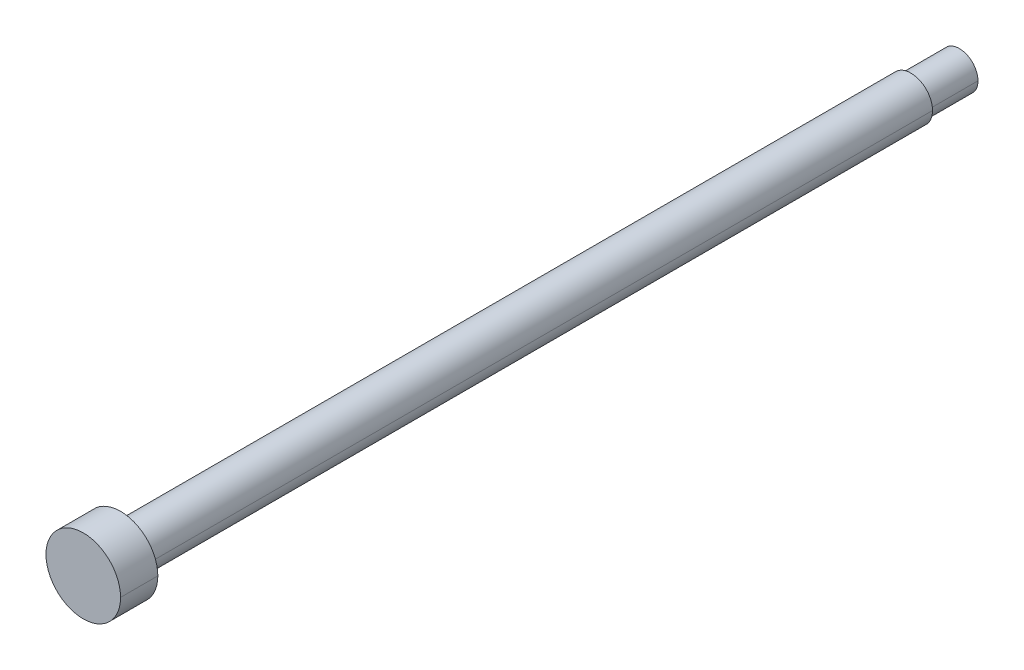
ISO-10303-21;
HEADER;
FILE_DESCRIPTION(('STEP AP214'),'2;1');
FILE_NAME('part.step','',(''),(''),'','','');
FILE_SCHEMA(('AUTOMOTIVE_DESIGN { 1 0 10303 214 1 1 1 1 }'));
ENDSEC;
DATA;
#1=APPLICATION_CONTEXT('core data for automotive mechanical design processes');
#2=APPLICATION_PROTOCOL_DEFINITION('international standard','automotive_design',2000,#1);
#3=PRODUCT_CONTEXT('',#1,'mechanical');
#4=PRODUCT('Part','Part','',(#3));
#5=PRODUCT_RELATED_PRODUCT_CATEGORY('part','',(#4));
#6=PRODUCT_DEFINITION_FORMATION('','',#4);
#7=PRODUCT_DEFINITION_CONTEXT('part definition',#1,'design');
#8=PRODUCT_DEFINITION('design','',#6,#7);
#9=PRODUCT_DEFINITION_SHAPE('','',#8);
#10=(LENGTH_UNIT() NAMED_UNIT(*) SI_UNIT(.MILLI.,.METRE.));
#11=(NAMED_UNIT(*) PLANE_ANGLE_UNIT() SI_UNIT($,.RADIAN.));
#12=(NAMED_UNIT(*) SI_UNIT($,.STERADIAN.) SOLID_ANGLE_UNIT());
#13=UNCERTAINTY_MEASURE_WITH_UNIT(LENGTH_MEASURE(1.E-05),#10,'distance_accuracy_value','');
#14=(GEOMETRIC_REPRESENTATION_CONTEXT(3) GLOBAL_UNCERTAINTY_ASSIGNED_CONTEXT((#13)) GLOBAL_UNIT_ASSIGNED_CONTEXT((#10,
#11,#12)) REPRESENTATION_CONTEXT('',''));
#15=CARTESIAN_POINT('',(0.,0.,0.));
#16=DIRECTION('',(0.,0.,1.));
#17=DIRECTION('',(1.,0.,0.));
#18=AXIS2_PLACEMENT_3D('',#15,#16,#17);
#19=CARTESIAN_POINT('',(0.,0.,-22.5));
#20=DIRECTION('',(0.,0.,-1.));
#21=DIRECTION('',(0.,-1.,0.));
#22=AXIS2_PLACEMENT_3D('',#19,#20,#21);
#23=PLANE('',#22);
#24=CARTESIAN_POINT('',(3.25,-1.5,-22.5));
#25=DIRECTION('',(0.,0.,-1.));
#26=DIRECTION('',(-1.,0.,0.));
#27=AXIS2_PLACEMENT_3D('',#24,#25,#26);
#28=CIRCLE('',#27,0.499999999999941);
#29=CARTESIAN_POINT('',(3.74999999999993,-1.5,-22.5));
#30=VERTEX_POINT('',#29);
#31=CARTESIAN_POINT('',(2.75000000000006,-1.5,-22.5));
#32=VERTEX_POINT('',#31);
#33=EDGE_CURVE('E10',#30,#32,#28,.T.);
#34=ORIENTED_EDGE('',*,*,#33,.T.);
#35=CARTESIAN_POINT('',(3.25,-1.5,-22.5));
#36=DIRECTION('',(0.,0.,-1.));
#37=DIRECTION('',(-1.,0.,0.));
#38=AXIS2_PLACEMENT_3D('',#35,#36,#37);
#39=CIRCLE('',#38,0.499999999999941);
#40=EDGE_CURVE('E146',#32,#30,#39,.T.);
#41=ORIENTED_EDGE('',*,*,#40,.T.);
#42=EDGE_LOOP('',(#34,#41));
#43=FACE_BOUND('',#42,.T.);
#44=ADVANCED_FACE('F15',(#43),#23,.T.);
#45=CARTESIAN_POINT('',(3.25,-1.5,-22.5));
#46=DIRECTION('',(0.,0.,1.));
#47=DIRECTION('',(1.,0.,0.));
#48=AXIS2_PLACEMENT_3D('',#45,#46,#47);
#49=CYLINDRICAL_SURFACE('',#48,0.499999999999941);
#50=DIRECTION('',(0.,0.,1.));
#51=VECTOR('',#50,1.);
#52=CARTESIAN_POINT('',(2.75000000000006,-1.5,-22.5));
#53=LINE('',#52,#51);
#54=CARTESIAN_POINT('',(2.75000000000006,-1.5,-21.2));
#55=VERTEX_POINT('',#54);
#56=EDGE_CURVE('E147',#32,#55,#53,.T.);
#57=ORIENTED_EDGE('',*,*,#56,.F.);
#58=ORIENTED_EDGE('',*,*,#33,.F.);
#59=DIRECTION('',(0.,0.,1.));
#60=VECTOR('',#59,1.);
#61=CARTESIAN_POINT('',(3.74999999999993,-1.5,-22.5));
#62=LINE('',#61,#60);
#63=CARTESIAN_POINT('',(3.74999999999993,-1.5,-21.2));
#64=VERTEX_POINT('',#63);
#65=EDGE_CURVE('E155',#30,#64,#62,.T.);
#66=ORIENTED_EDGE('',*,*,#65,.T.);
#67=CARTESIAN_POINT('',(3.25,-1.5,-21.2));
#68=DIRECTION('',(0.,0.,-1.));
#69=DIRECTION('',(-1.,0.,0.));
#70=AXIS2_PLACEMENT_3D('',#67,#68,#69);
#71=CIRCLE('',#70,0.499999999999941);
#72=EDGE_CURVE('E114',#64,#55,#71,.T.);
#73=ORIENTED_EDGE('',*,*,#72,.T.);
#74=EDGE_LOOP('',(#57,#58,#66,#73));
#75=FACE_BOUND('',#74,.T.);
#76=ADVANCED_FACE('F172',(#75),#49,.T.);
#77=CARTESIAN_POINT('',(0.,0.,1.));
#78=DIRECTION('',(0.,0.,1.));
#79=DIRECTION('',(1.,0.,0.));
#80=AXIS2_PLACEMENT_3D('',#77,#78,#79);
#81=PLANE('',#80);
#82=CARTESIAN_POINT('',(3.25000000000004,-1.50000000000005,1.));
#83=DIRECTION('',(0.,0.,1.));
#84=DIRECTION('',(1.,0.,0.));
#85=AXIS2_PLACEMENT_3D('',#82,#83,#84);
#86=CIRCLE('',#85,1.);
#87=CARTESIAN_POINT('',(4.25000000000005,-1.50000000000005,1.));
#88=VERTEX_POINT('',#87);
#89=CARTESIAN_POINT('',(2.25000000000004,-1.50000000000005,1.));
#90=VERTEX_POINT('',#89);
#91=EDGE_CURVE('E88',#88,#90,#86,.T.);
#92=ORIENTED_EDGE('',*,*,#91,.T.);
#93=CARTESIAN_POINT('',(3.25000000000004,-1.50000000000005,1.));
#94=DIRECTION('',(0.,0.,1.));
#95=DIRECTION('',(1.,0.,0.));
#96=AXIS2_PLACEMENT_3D('',#93,#94,#95);
#97=CIRCLE('',#96,1.);
#98=EDGE_CURVE('E25',#90,#88,#97,.T.);
#99=ORIENTED_EDGE('',*,*,#98,.T.);
#100=EDGE_LOOP('',(#92,#99));
#101=FACE_BOUND('',#100,.T.);
#102=ADVANCED_FACE('F17',(#101),#81,.T.);
#103=CARTESIAN_POINT('',(0.,0.,0.));
#104=DIRECTION('',(0.,0.,1.));
#105=DIRECTION('',(0.,-1.,0.));
#106=AXIS2_PLACEMENT_3D('',#103,#104,#105);
#107=PLANE('',#106);
#108=CARTESIAN_POINT('',(3.25,-1.5,0.));
#109=DIRECTION('',(0.,0.,1.));
#110=DIRECTION('',(0.,-1.,0.));
#111=AXIS2_PLACEMENT_3D('',#108,#109,#110);
#112=CIRCLE('',#111,0.58);
#113=CARTESIAN_POINT('',(2.67,-1.5,0.));
#114=VERTEX_POINT('',#113);
#115=CARTESIAN_POINT('',(3.83,-1.5,0.));
#116=VERTEX_POINT('',#115);
#117=EDGE_CURVE('E115',#114,#116,#112,.T.);
#118=ORIENTED_EDGE('',*,*,#117,.T.);
#119=CARTESIAN_POINT('',(3.25,-1.5,0.));
#120=DIRECTION('',(0.,0.,1.));
#121=DIRECTION('',(0.,-1.,0.));
#122=AXIS2_PLACEMENT_3D('',#119,#120,#121);
#123=CIRCLE('',#122,0.58);
#124=EDGE_CURVE('E99',#116,#114,#123,.T.);
#125=ORIENTED_EDGE('',*,*,#124,.T.);
#126=EDGE_LOOP('',(#118,#125));
#127=FACE_BOUND('',#126,.T.);
#128=CARTESIAN_POINT('',(3.25000000000004,-1.50000000000005,0.));
#129=DIRECTION('',(0.,0.,-1.));
#130=DIRECTION('',(0.,-1.,0.));
#131=AXIS2_PLACEMENT_3D('',#128,#129,#130);
#132=CIRCLE('',#131,1.);
#133=CARTESIAN_POINT('',(4.25000000000005,-1.50000000000005,0.));
#134=VERTEX_POINT('',#133);
#135=CARTESIAN_POINT('',(2.25000000000004,-1.50000000000005,0.));
#136=VERTEX_POINT('',#135);
#137=EDGE_CURVE('E91',#134,#136,#132,.T.);
#138=ORIENTED_EDGE('',*,*,#137,.T.);
#139=CARTESIAN_POINT('',(3.25000000000004,-1.50000000000005,0.));
#140=DIRECTION('',(0.,0.,-1.));
#141=DIRECTION('',(0.,-1.,0.));
#142=AXIS2_PLACEMENT_3D('',#139,#140,#141);
#143=CIRCLE('',#142,1.);
#144=EDGE_CURVE('E109',#136,#134,#143,.T.);
#145=ORIENTED_EDGE('',*,*,#144,.T.);
#146=EDGE_LOOP('',(#138,#145));
#147=FACE_BOUND('',#146,.T.);
#148=ADVANCED_FACE('F161',(#127,#147),#107,.F.);
#149=CARTESIAN_POINT('',(3.25000000000004,-1.50000000000005,-2.82842712474619));
#150=DIRECTION('',(0.,0.,1.));
#151=DIRECTION('',(1.,0.,0.));
#152=AXIS2_PLACEMENT_3D('',#149,#150,#151);
#153=CYLINDRICAL_SURFACE('',#152,1.);
#154=DIRECTION('',(0.,0.,1.));
#155=VECTOR('',#154,1.);
#156=CARTESIAN_POINT('',(2.25000000000004,-1.50000000000005,-2.82842712474619));
#157=LINE('',#156,#155);
#158=EDGE_CURVE('E102',#136,#90,#157,.T.);
#159=ORIENTED_EDGE('',*,*,#158,.F.);
#160=ORIENTED_EDGE('',*,*,#137,.F.);
#161=DIRECTION('',(0.,0.,1.));
#162=VECTOR('',#161,1.);
#163=CARTESIAN_POINT('',(4.25000000000005,-1.50000000000005,-2.82842712474619));
#164=LINE('',#163,#162);
#165=EDGE_CURVE('E93',#134,#88,#164,.T.);
#166=ORIENTED_EDGE('',*,*,#165,.T.);
#167=ORIENTED_EDGE('',*,*,#98,.F.);
#168=EDGE_LOOP('',(#159,#160,#166,#167));
#169=FACE_BOUND('',#168,.T.);
#170=ADVANCED_FACE('F94',(#169),#153,.T.);
#171=CARTESIAN_POINT('',(0.,0.,-21.2));
#172=DIRECTION('',(0.,0.,1.));
#173=DIRECTION('',(1.,0.,0.));
#174=AXIS2_PLACEMENT_3D('',#171,#172,#173);
#175=PLANE('',#174);
#176=ORIENTED_EDGE('',*,*,#72,.F.);
#177=CARTESIAN_POINT('',(3.25,-1.5,-21.2));
#178=DIRECTION('',(0.,0.,-1.));
#179=DIRECTION('',(-1.,0.,0.));
#180=AXIS2_PLACEMENT_3D('',#177,#178,#179);
#181=CIRCLE('',#180,0.499999999999941);
#182=EDGE_CURVE('E151',#55,#64,#181,.T.);
#183=ORIENTED_EDGE('',*,*,#182,.F.);
#184=EDGE_LOOP('',(#176,#183));
#185=FACE_BOUND('',#184,.T.);
#186=CARTESIAN_POINT('',(3.25,-1.5,-21.2));
#187=DIRECTION('',(0.,0.,1.));
#188=DIRECTION('',(1.,0.,0.));
#189=AXIS2_PLACEMENT_3D('',#186,#187,#188);
#190=CIRCLE('',#189,0.58);
#191=CARTESIAN_POINT('',(2.67,-1.5,-21.2));
#192=VERTEX_POINT('',#191);
#193=CARTESIAN_POINT('',(3.83,-1.5,-21.2));
#194=VERTEX_POINT('',#193);
#195=EDGE_CURVE('E38',#192,#194,#190,.T.);
#196=ORIENTED_EDGE('',*,*,#195,.F.);
#197=CARTESIAN_POINT('',(3.25,-1.5,-21.2));
#198=DIRECTION('',(0.,0.,1.));
#199=DIRECTION('',(1.,0.,0.));
#200=AXIS2_PLACEMENT_3D('',#197,#198,#199);
#201=CIRCLE('',#200,0.58);
#202=EDGE_CURVE('E126',#194,#192,#201,.T.);
#203=ORIENTED_EDGE('',*,*,#202,.F.);
#204=EDGE_LOOP('',(#196,#203));
#205=FACE_BOUND('',#204,.T.);
#206=ADVANCED_FACE('F170',(#185,#205),#175,.F.);
#207=CARTESIAN_POINT('',(3.25,-1.5,1.));
#208=DIRECTION('',(0.,0.,-1.));
#209=DIRECTION('',(-1.,0.,0.));
#210=AXIS2_PLACEMENT_3D('',#207,#208,#209);
#211=CYLINDRICAL_SURFACE('',#210,0.58);
#212=DIRECTION('',(0.,0.,-1.));
#213=VECTOR('',#212,1.);
#214=CARTESIAN_POINT('',(3.83,-1.5,1.));
#215=LINE('',#214,#213);
#216=EDGE_CURVE('E119',#116,#194,#215,.T.);
#217=ORIENTED_EDGE('',*,*,#216,.F.);
#218=ORIENTED_EDGE('',*,*,#117,.F.);
#219=DIRECTION('',(0.,0.,-1.));
#220=VECTOR('',#219,1.);
#221=CARTESIAN_POINT('',(2.67,-1.5,1.));
#222=LINE('',#221,#220);
#223=EDGE_CURVE('E122',#114,#192,#222,.T.);
#224=ORIENTED_EDGE('',*,*,#223,.T.);
#225=ORIENTED_EDGE('',*,*,#195,.T.);
#226=EDGE_LOOP('',(#217,#218,#224,#225));
#227=FACE_BOUND('',#226,.T.);
#228=ADVANCED_FACE('F184',(#227),#211,.T.);
#229=CARTESIAN_POINT('',(3.25,-1.5,1.));
#230=DIRECTION('',(0.,0.,-1.));
#231=DIRECTION('',(-1.,0.,0.));
#232=AXIS2_PLACEMENT_3D('',#229,#230,#231);
#233=CYLINDRICAL_SURFACE('',#232,0.58);
#234=ORIENTED_EDGE('',*,*,#124,.F.);
#235=ORIENTED_EDGE('',*,*,#216,.T.);
#236=ORIENTED_EDGE('',*,*,#202,.T.);
#237=ORIENTED_EDGE('',*,*,#223,.F.);
#238=EDGE_LOOP('',(#234,#235,#236,#237));
#239=FACE_BOUND('',#238,.T.);
#240=ADVANCED_FACE('F183',(#239),#233,.T.);
#241=CARTESIAN_POINT('',(3.25000000000004,-1.50000000000005,-2.82842712474619));
#242=DIRECTION('',(0.,0.,1.));
#243=DIRECTION('',(1.,0.,0.));
#244=AXIS2_PLACEMENT_3D('',#241,#242,#243);
#245=CYLINDRICAL_SURFACE('',#244,1.);
#246=ORIENTED_EDGE('',*,*,#144,.F.);
#247=ORIENTED_EDGE('',*,*,#158,.T.);
#248=ORIENTED_EDGE('',*,*,#91,.F.);
#249=ORIENTED_EDGE('',*,*,#165,.F.);
#250=EDGE_LOOP('',(#246,#247,#248,#249));
#251=FACE_BOUND('',#250,.T.);
#252=ADVANCED_FACE('F101',(#251),#245,.T.);
#253=CARTESIAN_POINT('',(3.25,-1.5,-22.5));
#254=DIRECTION('',(0.,0.,1.));
#255=DIRECTION('',(1.,0.,0.));
#256=AXIS2_PLACEMENT_3D('',#253,#254,#255);
#257=CYLINDRICAL_SURFACE('',#256,0.499999999999941);
#258=ORIENTED_EDGE('',*,*,#40,.F.);
#259=ORIENTED_EDGE('',*,*,#56,.T.);
#260=ORIENTED_EDGE('',*,*,#182,.T.);
#261=ORIENTED_EDGE('',*,*,#65,.F.);
#262=EDGE_LOOP('',(#258,#259,#260,#261));
#263=FACE_BOUND('',#262,.T.);
#264=ADVANCED_FACE('F197',(#263),#257,.T.);
#265=CLOSED_SHELL('',(#44,#76,#102,#148,#170,#206,#228,#240,#252,#264));
#266=MANIFOLD_SOLID_BREP('B1',#265);
#267=ADVANCED_BREP_SHAPE_REPRESENTATION('',(#18,#266),#14);
#268=SHAPE_DEFINITION_REPRESENTATION(#9,#267);
ENDSEC;
END-ISO-10303-21;
